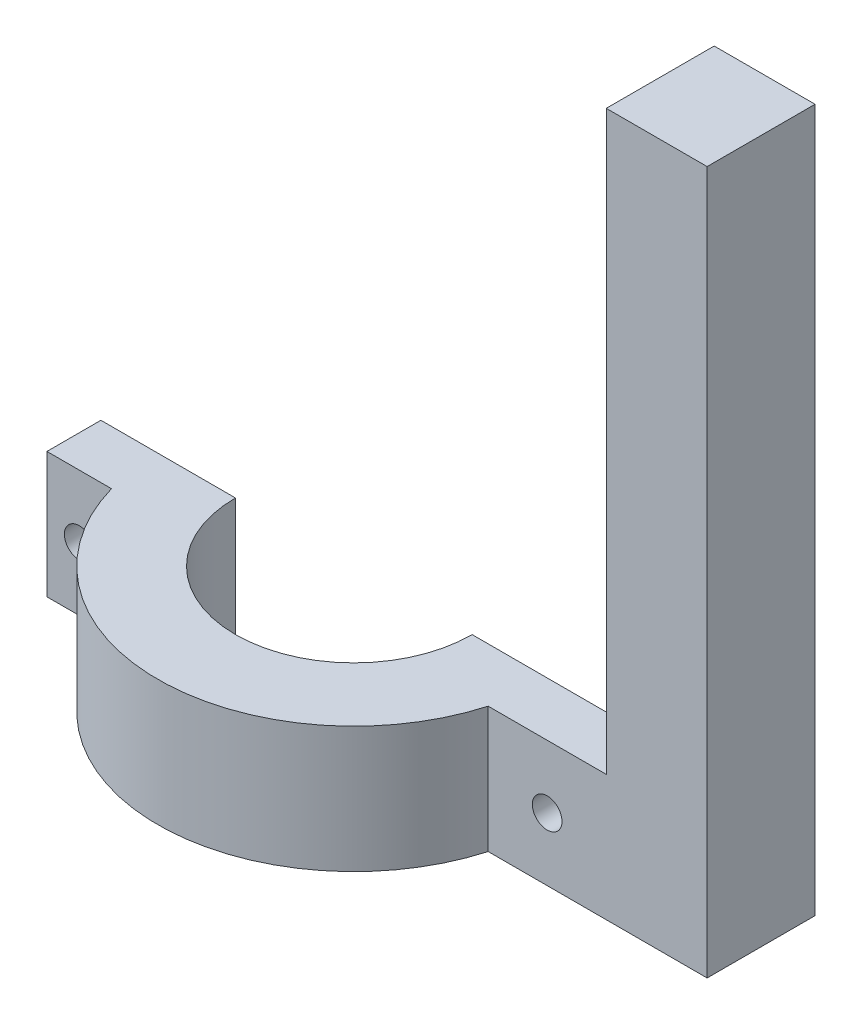
ISO-10303-21;
HEADER;
FILE_DESCRIPTION(('STEP AP214'),'2;1');
FILE_NAME('part.step','',(''),(''),'','','');
FILE_SCHEMA(('AUTOMOTIVE_DESIGN { 1 0 10303 214 1 1 1 1 }'));
ENDSEC;
DATA;
#1=APPLICATION_CONTEXT('core data for automotive mechanical design processes');
#2=APPLICATION_PROTOCOL_DEFINITION('international standard','automotive_design',2000,#1);
#3=PRODUCT_CONTEXT('',#1,'mechanical');
#4=PRODUCT('Part','Part','',(#3));
#5=PRODUCT_RELATED_PRODUCT_CATEGORY('part','',(#4));
#6=PRODUCT_DEFINITION_FORMATION('','',#4);
#7=PRODUCT_DEFINITION_CONTEXT('part definition',#1,'design');
#8=PRODUCT_DEFINITION('design','',#6,#7);
#9=PRODUCT_DEFINITION_SHAPE('','',#8);
#10=(LENGTH_UNIT() NAMED_UNIT(*) SI_UNIT(.MILLI.,.METRE.));
#11=(NAMED_UNIT(*) PLANE_ANGLE_UNIT() SI_UNIT($,.RADIAN.));
#12=(NAMED_UNIT(*) SI_UNIT($,.STERADIAN.) SOLID_ANGLE_UNIT());
#13=UNCERTAINTY_MEASURE_WITH_UNIT(LENGTH_MEASURE(1.E-05),#10,'distance_accuracy_value','');
#14=(GEOMETRIC_REPRESENTATION_CONTEXT(3) GLOBAL_UNCERTAINTY_ASSIGNED_CONTEXT((#13)) GLOBAL_UNIT_ASSIGNED_CONTEXT((#10,
#11,#12)) REPRESENTATION_CONTEXT('',''));
#15=CARTESIAN_POINT('',(0.,0.,0.));
#16=DIRECTION('',(0.,0.,1.));
#17=DIRECTION('',(1.,0.,0.));
#18=AXIS2_PLACEMENT_3D('',#15,#16,#17);
#19=CARTESIAN_POINT('',(25.14,-74.82,6.955));
#20=DIRECTION('',(1.,0.,0.));
#21=DIRECTION('',(0.,0.,-1.));
#22=AXIS2_PLACEMENT_3D('',#19,#20,#21);
#23=PLANE('',#22);
#24=DIRECTION('',(0.,1.,0.));
#25=VECTOR('',#24,1.);
#26=CARTESIAN_POINT('',(25.14,-74.82,6.955));
#27=LINE('',#26,#25);
#28=CARTESIAN_POINT('',(25.14,-58.59,6.955));
#29=VERTEX_POINT('',#28);
#30=CARTESIAN_POINT('',(25.14,15.7457363650206,6.955));
#31=VERTEX_POINT('',#30);
#32=EDGE_CURVE('E187',#29,#31,#27,.T.);
#33=ORIENTED_EDGE('',*,*,#32,.T.);
#34=DIRECTION('',(0.,0.,1.));
#35=VECTOR('',#34,1.);
#36=CARTESIAN_POINT('',(25.14,15.7457363650206,6.955));
#37=LINE('',#36,#35);
#38=CARTESIAN_POINT('',(25.14,15.7457363650206,-6.955));
#39=VERTEX_POINT('',#38);
#40=EDGE_CURVE('E181',#39,#31,#37,.T.);
#41=ORIENTED_EDGE('',*,*,#40,.F.);
#42=DIRECTION('',(0.,1.,0.));
#43=VECTOR('',#42,1.);
#44=CARTESIAN_POINT('',(25.14,-74.82,-6.955));
#45=LINE('',#44,#43);
#46=CARTESIAN_POINT('',(25.14,-74.82,-6.955));
#47=VERTEX_POINT('',#46);
#48=EDGE_CURVE('E179',#47,#39,#45,.T.);
#49=ORIENTED_EDGE('',*,*,#48,.F.);
#50=DIRECTION('',(0.,0.,-1.));
#51=VECTOR('',#50,1.);
#52=CARTESIAN_POINT('',(25.14,-74.82,0.));
#53=LINE('',#52,#51);
#54=CARTESIAN_POINT('',(25.14,-74.82,0.));
#55=VERTEX_POINT('',#54);
#56=EDGE_CURVE('E261',#55,#47,#53,.T.);
#57=ORIENTED_EDGE('',*,*,#56,.F.);
#58=DIRECTION('',(0.,1.,0.));
#59=VECTOR('',#58,1.);
#60=CARTESIAN_POINT('',(25.14,-74.82,0.));
#61=LINE('',#60,#59);
#62=CARTESIAN_POINT('',(25.14,-58.59,0.));
#63=VERTEX_POINT('',#62);
#64=EDGE_CURVE('E211',#55,#63,#61,.T.);
#65=ORIENTED_EDGE('',*,*,#64,.T.);
#66=DIRECTION('',(0.,0.,-1.));
#67=VECTOR('',#66,1.);
#68=CARTESIAN_POINT('',(25.14,-58.59,-6.955));
#69=LINE('',#68,#67);
#70=EDGE_CURVE('E199',#29,#63,#69,.T.);
#71=ORIENTED_EDGE('',*,*,#70,.F.);
#72=EDGE_LOOP('',(#33,#41,#49,#57,#65,#71));
#73=FACE_BOUND('',#72,.T.);
#74=ADVANCED_FACE('F80',(#73),#23,.F.);
#75=CARTESIAN_POINT('',(38.14,5.74573636502059,-6.955));
#76=DIRECTION('',(0.,0.,1.));
#77=DIRECTION('',(0.,-1.,0.));
#78=AXIS2_PLACEMENT_3D('',#75,#76,#77);
#79=PLANE('',#78);
#80=ORIENTED_EDGE('',*,*,#48,.T.);
#81=DIRECTION('',(-1.,0.,0.));
#82=VECTOR('',#81,1.);
#83=CARTESIAN_POINT('',(38.14,15.7457363650206,-6.955));
#84=LINE('',#83,#82);
#85=CARTESIAN_POINT('',(38.14,15.7457363650206,-6.955));
#86=VERTEX_POINT('',#85);
#87=EDGE_CURVE('E166',#86,#39,#84,.T.);
#88=ORIENTED_EDGE('',*,*,#87,.F.);
#89=DIRECTION('',(0.,1.,0.));
#90=VECTOR('',#89,1.);
#91=CARTESIAN_POINT('',(38.14,5.74573636502059,-6.955));
#92=LINE('',#91,#90);
#93=CARTESIAN_POINT('',(38.14,-74.82,-6.955));
#94=VERTEX_POINT('',#93);
#95=EDGE_CURVE('E177',#94,#86,#92,.T.);
#96=ORIENTED_EDGE('',*,*,#95,.F.);
#97=DIRECTION('',(1.,0.,0.));
#98=VECTOR('',#97,1.);
#99=CARTESIAN_POINT('',(38.14,-74.82,-6.955));
#100=LINE('',#99,#98);
#101=EDGE_CURVE('E193',#47,#94,#100,.T.);
#102=ORIENTED_EDGE('',*,*,#101,.F.);
#103=EDGE_LOOP('',(#80,#88,#96,#102));
#104=FACE_BOUND('',#103,.T.);
#105=ADVANCED_FACE('F82',(#104),#79,.F.);
#106=CARTESIAN_POINT('',(38.14,5.74573636502059,6.955));
#107=DIRECTION('',(0.,0.,-1.));
#108=DIRECTION('',(-1.,0.,0.));
#109=AXIS2_PLACEMENT_3D('',#106,#107,#108);
#110=PLANE('',#109);
#111=DIRECTION('',(0.,-1.,0.));
#112=VECTOR('',#111,1.);
#113=CARTESIAN_POINT('',(38.14,5.74573636502059,6.955));
#114=LINE('',#113,#112);
#115=CARTESIAN_POINT('',(38.14,15.7457363650206,6.955));
#116=VERTEX_POINT('',#115);
#117=CARTESIAN_POINT('',(38.14,-74.82,6.955));
#118=VERTEX_POINT('',#117);
#119=EDGE_CURVE('E186',#116,#118,#114,.T.);
#120=ORIENTED_EDGE('',*,*,#119,.F.);
#121=DIRECTION('',(1.,0.,0.));
#122=VECTOR('',#121,1.);
#123=CARTESIAN_POINT('',(38.14,15.7457363650206,6.955));
#124=LINE('',#123,#122);
#125=EDGE_CURVE('E169',#31,#116,#124,.T.);
#126=ORIENTED_EDGE('',*,*,#125,.F.);
#127=ORIENTED_EDGE('',*,*,#32,.F.);
#128=DIRECTION('',(1.,0.,0.));
#129=VECTOR('',#128,1.);
#130=CARTESIAN_POINT('',(9.92000000000001,-58.59,6.955));
#131=LINE('',#130,#129);
#132=CARTESIAN_POINT('',(9.92324607463947,-58.59,6.955));
#133=VERTEX_POINT('',#132);
#134=EDGE_CURVE('E220',#133,#29,#131,.T.);
#135=ORIENTED_EDGE('',*,*,#134,.F.);
#136=DIRECTION('',(0.,1.,0.));
#137=VECTOR('',#136,1.);
#138=CARTESIAN_POINT('',(9.92324607463947,-74.82,6.955));
#139=LINE('',#138,#137);
#140=CARTESIAN_POINT('',(9.92324607463947,-74.82,6.955));
#141=VERTEX_POINT('',#140);
#142=EDGE_CURVE('E200',#133,#141,#139,.F.);
#143=ORIENTED_EDGE('',*,*,#142,.T.);
#144=DIRECTION('',(-1.,0.,0.));
#145=VECTOR('',#144,1.);
#146=CARTESIAN_POINT('',(38.14,-74.82,6.955));
#147=LINE('',#146,#145);
#148=EDGE_CURVE('E214',#118,#141,#147,.T.);
#149=ORIENTED_EDGE('',*,*,#148,.F.);
#150=EDGE_LOOP('',(#120,#126,#127,#135,#143,#149));
#151=FACE_BOUND('',#150,.T.);
#152=CARTESIAN_POINT('',(17.5248952643869,-66.705,6.955));
#153=DIRECTION('',(0.,0.,-1.));
#154=DIRECTION('',(-1.,0.,0.));
#155=AXIS2_PLACEMENT_3D('',#152,#153,#154);
#156=CIRCLE('',#155,1.91);
#157=CARTESIAN_POINT('',(15.6148952643869,-66.705,6.955));
#158=VERTEX_POINT('',#157);
#159=EDGE_CURVE('E196',#158,#158,#156,.T.);
#160=ORIENTED_EDGE('',*,*,#159,.T.);
#161=EDGE_LOOP('',(#160));
#162=FACE_BOUND('',#161,.T.);
#163=ADVANCED_FACE('F269',(#151,#162),#110,.F.);
#164=CARTESIAN_POINT('',(38.14,0.,0.));
#165=DIRECTION('',(1.,0.,0.));
#166=DIRECTION('',(0.,0.,-1.));
#167=AXIS2_PLACEMENT_3D('',#164,#165,#166);
#168=PLANE('',#167);
#169=ORIENTED_EDGE('',*,*,#95,.T.);
#170=DIRECTION('',(0.,0.,-1.));
#171=VECTOR('',#170,1.);
#172=CARTESIAN_POINT('',(38.14,15.7457363650206,6.955));
#173=LINE('',#172,#171);
#174=EDGE_CURVE('E163',#116,#86,#173,.T.);
#175=ORIENTED_EDGE('',*,*,#174,.F.);
#176=ORIENTED_EDGE('',*,*,#119,.T.);
#177=DIRECTION('',(0.,0.,1.));
#178=VECTOR('',#177,1.);
#179=CARTESIAN_POINT('',(38.14,-74.82,6.955));
#180=LINE('',#179,#178);
#181=EDGE_CURVE('E185',#94,#118,#180,.T.);
#182=ORIENTED_EDGE('',*,*,#181,.F.);
#183=EDGE_LOOP('',(#169,#175,#176,#182));
#184=FACE_BOUND('',#183,.T.);
#185=ADVANCED_FACE('F183',(#184),#168,.T.);
#186=CARTESIAN_POINT('',(0.,-74.82,0.));
#187=DIRECTION('',(0.,1.,0.));
#188=DIRECTION('',(0.,0.,1.));
#189=AXIS2_PLACEMENT_3D('',#186,#187,#188);
#190=PLANE('',#189);
#191=DIRECTION('',(0.,0.,-1.));
#192=VECTOR('',#191,1.);
#193=CARTESIAN_POINT('',(-46.9432460746395,-74.82,25.25));
#194=LINE('',#193,#192);
#195=CARTESIAN_POINT('',(-46.9432460746395,-74.82,6.955));
#196=VERTEX_POINT('',#195);
#197=CARTESIAN_POINT('',(-46.9432460746395,-74.82,0.));
#198=VERTEX_POINT('',#197);
#199=EDGE_CURVE('E241',#196,#198,#194,.T.);
#200=ORIENTED_EDGE('',*,*,#199,.T.);
#201=DIRECTION('',(1.,0.,0.));
#202=VECTOR('',#201,1.);
#203=CARTESIAN_POINT('',(25.14,-74.82,0.));
#204=LINE('',#203,#202);
#205=CARTESIAN_POINT('',(-29.6,-74.82,0.));
#206=VERTEX_POINT('',#205);
#207=EDGE_CURVE('E105',#198,#206,#204,.T.);
#208=ORIENTED_EDGE('',*,*,#207,.T.);
#209=CARTESIAN_POINT('',(-14.35,-74.82,0.));
#210=DIRECTION('',(0.,1.,0.));
#211=DIRECTION('',(0.,0.,1.));
#212=AXIS2_PLACEMENT_3D('',#209,#210,#211);
#213=CIRCLE('',#212,15.25);
#214=CARTESIAN_POINT('',(0.900000000000007,-74.82,0.));
#215=VERTEX_POINT('',#214);
#216=EDGE_CURVE('E231',#206,#215,#213,.T.);
#217=ORIENTED_EDGE('',*,*,#216,.T.);
#218=EDGE_CURVE('E97',#215,#55,#204,.T.);
#219=ORIENTED_EDGE('',*,*,#218,.T.);
#220=ORIENTED_EDGE('',*,*,#56,.T.);
#221=ORIENTED_EDGE('',*,*,#101,.T.);
#222=ORIENTED_EDGE('',*,*,#181,.T.);
#223=ORIENTED_EDGE('',*,*,#148,.T.);
#224=CARTESIAN_POINT('',(-14.35,-74.82,0.));
#225=DIRECTION('',(0.,1.,0.));
#226=DIRECTION('',(1.,0.,0.));
#227=AXIS2_PLACEMENT_3D('',#224,#225,#226);
#228=CIRCLE('',#227,25.25);
#229=CARTESIAN_POINT('',(-38.6232460746395,-74.82,6.955));
#230=VERTEX_POINT('',#229);
#231=EDGE_CURVE('E228',#230,#141,#228,.T.);
#232=ORIENTED_EDGE('',*,*,#231,.F.);
#233=DIRECTION('',(1.,0.,0.));
#234=VECTOR('',#233,1.);
#235=CARTESIAN_POINT('',(-50.,-74.82,6.955));
#236=LINE('',#235,#234);
#237=EDGE_CURVE('E236',#196,#230,#236,.T.);
#238=ORIENTED_EDGE('',*,*,#237,.F.);
#239=EDGE_LOOP('',(#200,#208,#217,#219,#220,#221,#222,#223,#232,#238));
#240=FACE_BOUND('',#239,.T.);
#241=ADVANCED_FACE('F272',(#240),#190,.F.);
#242=CARTESIAN_POINT('',(9.92000000000001,-58.59,-6.955));
#243=DIRECTION('',(0.,-1.,0.));
#244=DIRECTION('',(0.,0.,-1.));
#245=AXIS2_PLACEMENT_3D('',#242,#243,#244);
#246=PLANE('',#245);
#247=ORIENTED_EDGE('',*,*,#70,.T.);
#248=DIRECTION('',(1.,0.,0.));
#249=VECTOR('',#248,1.);
#250=CARTESIAN_POINT('',(25.14,-58.59,0.));
#251=LINE('',#250,#249);
#252=CARTESIAN_POINT('',(0.900000000000007,-58.59,0.));
#253=VERTEX_POINT('',#252);
#254=EDGE_CURVE('E257',#253,#63,#251,.T.);
#255=ORIENTED_EDGE('',*,*,#254,.F.);
#256=CARTESIAN_POINT('',(-14.35,-58.59,0.));
#257=DIRECTION('',(0.,1.,0.));
#258=DIRECTION('',(0.,0.,1.));
#259=AXIS2_PLACEMENT_3D('',#256,#257,#258);
#260=CIRCLE('',#259,15.25);
#261=CARTESIAN_POINT('',(-29.6,-58.59,0.));
#262=VERTEX_POINT('',#261);
#263=EDGE_CURVE('E233',#262,#253,#260,.T.);
#264=ORIENTED_EDGE('',*,*,#263,.F.);
#265=CARTESIAN_POINT('',(-46.9432460746395,-58.59,0.));
#266=VERTEX_POINT('',#265);
#267=EDGE_CURVE('E259',#266,#262,#251,.T.);
#268=ORIENTED_EDGE('',*,*,#267,.F.);
#269=DIRECTION('',(0.,0.,-1.));
#270=VECTOR('',#269,1.);
#271=CARTESIAN_POINT('',(-46.9432460746395,-58.59,25.25));
#272=LINE('',#271,#270);
#273=CARTESIAN_POINT('',(-46.9432460746395,-58.59,6.955));
#274=VERTEX_POINT('',#273);
#275=EDGE_CURVE('E206',#274,#266,#272,.T.);
#276=ORIENTED_EDGE('',*,*,#275,.F.);
#277=DIRECTION('',(1.,0.,0.));
#278=VECTOR('',#277,1.);
#279=CARTESIAN_POINT('',(-50.,-58.59,6.955));
#280=LINE('',#279,#278);
#281=CARTESIAN_POINT('',(-38.6232460746395,-58.59,6.955));
#282=VERTEX_POINT('',#281);
#283=EDGE_CURVE('E239',#274,#282,#280,.T.);
#284=ORIENTED_EDGE('',*,*,#283,.T.);
#285=CARTESIAN_POINT('',(-14.35,-58.59,0.));
#286=DIRECTION('',(0.,1.,0.));
#287=DIRECTION('',(1.,0.,0.));
#288=AXIS2_PLACEMENT_3D('',#285,#286,#287);
#289=CIRCLE('',#288,25.25);
#290=EDGE_CURVE('E229',#282,#133,#289,.T.);
#291=ORIENTED_EDGE('',*,*,#290,.T.);
#292=ORIENTED_EDGE('',*,*,#134,.T.);
#293=EDGE_LOOP('',(#247,#255,#264,#268,#276,#284,#291,#292));
#294=FACE_BOUND('',#293,.T.);
#295=ADVANCED_FACE('F275',(#294),#246,.F.);
#296=CARTESIAN_POINT('',(17.5248952643869,-66.705,8.26499999999999));
#297=DIRECTION('',(0.,0.,-1.));
#298=DIRECTION('',(0.,1.,0.));
#299=AXIS2_PLACEMENT_3D('',#296,#297,#298);
#300=CYLINDRICAL_SURFACE('',#299,1.91);
#301=CARTESIAN_POINT('',(17.5248952643869,-66.705,0.));
#302=DIRECTION('',(0.,0.,1.));
#303=DIRECTION('',(1.,0.,0.));
#304=AXIS2_PLACEMENT_3D('',#301,#302,#303);
#305=CIRCLE('',#304,1.91);
#306=CARTESIAN_POINT('',(19.4348952643869,-66.705,0.));
#307=VERTEX_POINT('',#306);
#308=EDGE_CURVE('E207',#307,#307,#305,.F.);
#309=ORIENTED_EDGE('',*,*,#308,.T.);
#310=EDGE_LOOP('',(#309));
#311=FACE_BOUND('',#310,.T.);
#312=ORIENTED_EDGE('',*,*,#159,.F.);
#313=EDGE_LOOP('',(#312));
#314=FACE_BOUND('',#313,.T.);
#315=ADVANCED_FACE('F281',(#311,#314),#300,.F.);
#316=CARTESIAN_POINT('',(-14.35,-74.82,0.));
#317=DIRECTION('',(0.,1.,0.));
#318=DIRECTION('',(0.,0.,1.));
#319=AXIS2_PLACEMENT_3D('',#316,#317,#318);
#320=CYLINDRICAL_SURFACE('',#319,25.25);
#321=DIRECTION('',(0.,1.,0.));
#322=VECTOR('',#321,1.);
#323=CARTESIAN_POINT('',(-38.6232460746395,-74.82,6.955));
#324=LINE('',#323,#322);
#325=EDGE_CURVE('E89',#230,#282,#324,.T.);
#326=ORIENTED_EDGE('',*,*,#325,.F.);
#327=ORIENTED_EDGE('',*,*,#231,.T.);
#328=ORIENTED_EDGE('',*,*,#142,.F.);
#329=ORIENTED_EDGE('',*,*,#290,.F.);
#330=EDGE_LOOP('',(#326,#327,#328,#329));
#331=FACE_BOUND('',#330,.T.);
#332=ADVANCED_FACE('F350',(#331),#320,.T.);
#333=CARTESIAN_POINT('',(-14.35,-74.82,0.));
#334=DIRECTION('',(0.,1.,0.));
#335=DIRECTION('',(0.,0.,1.));
#336=AXIS2_PLACEMENT_3D('',#333,#334,#335);
#337=CYLINDRICAL_SURFACE('',#336,15.25);
#338=ORIENTED_EDGE('',*,*,#263,.T.);
#339=DIRECTION('',(0.,1.,0.));
#340=VECTOR('',#339,1.);
#341=CARTESIAN_POINT('',(0.900000000000007,-74.82,0.));
#342=LINE('',#341,#340);
#343=EDGE_CURVE('E249',#253,#215,#342,.F.);
#344=ORIENTED_EDGE('',*,*,#343,.T.);
#345=ORIENTED_EDGE('',*,*,#216,.F.);
#346=DIRECTION('',(0.,1.,0.));
#347=VECTOR('',#346,1.);
#348=CARTESIAN_POINT('',(-29.6,-74.82,0.));
#349=LINE('',#348,#347);
#350=EDGE_CURVE('E251',#206,#262,#349,.T.);
#351=ORIENTED_EDGE('',*,*,#350,.T.);
#352=EDGE_LOOP('',(#338,#344,#345,#351));
#353=FACE_BOUND('',#352,.T.);
#354=ADVANCED_FACE('F346',(#353),#337,.F.);
#355=CARTESIAN_POINT('',(-50.,-58.59,6.955));
#356=DIRECTION('',(0.,0.,1.));
#357=DIRECTION('',(1.,0.,0.));
#358=AXIS2_PLACEMENT_3D('',#355,#356,#357);
#359=PLANE('',#358);
#360=CARTESIAN_POINT('',(-42.7865081517211,-66.705,6.955));
#361=DIRECTION('',(0.,0.,1.));
#362=DIRECTION('',(1.,0.,0.));
#363=AXIS2_PLACEMENT_3D('',#360,#361,#362);
#364=CIRCLE('',#363,1.91);
#365=CARTESIAN_POINT('',(-40.8765081517211,-66.705,6.955));
#366=VERTEX_POINT('',#365);
#367=EDGE_CURVE('E203',#366,#366,#364,.T.);
#368=ORIENTED_EDGE('',*,*,#367,.F.);
#369=EDGE_LOOP('',(#368));
#370=FACE_BOUND('',#369,.T.);
#371=DIRECTION('',(0.,1.,0.));
#372=VECTOR('',#371,1.);
#373=CARTESIAN_POINT('',(-46.9432460746395,-58.59,6.955));
#374=LINE('',#373,#372);
#375=EDGE_CURVE('E14',#196,#274,#374,.T.);
#376=ORIENTED_EDGE('',*,*,#375,.F.);
#377=ORIENTED_EDGE('',*,*,#237,.T.);
#378=ORIENTED_EDGE('',*,*,#325,.T.);
#379=ORIENTED_EDGE('',*,*,#283,.F.);
#380=EDGE_LOOP('',(#376,#377,#378,#379));
#381=FACE_BOUND('',#380,.T.);
#382=ADVANCED_FACE('F340',(#370,#381),#359,.T.);
#383=CARTESIAN_POINT('',(-46.9432460746395,-74.82,25.25));
#384=DIRECTION('',(1.,0.,0.));
#385=DIRECTION('',(0.,0.,-1.));
#386=AXIS2_PLACEMENT_3D('',#383,#384,#385);
#387=PLANE('',#386);
#388=ORIENTED_EDGE('',*,*,#275,.T.);
#389=DIRECTION('',(0.,-1.,0.));
#390=VECTOR('',#389,1.);
#391=CARTESIAN_POINT('',(-46.9432460746395,-74.82,0.));
#392=LINE('',#391,#390);
#393=EDGE_CURVE('E210',#266,#198,#392,.T.);
#394=ORIENTED_EDGE('',*,*,#393,.T.);
#395=ORIENTED_EDGE('',*,*,#199,.F.);
#396=ORIENTED_EDGE('',*,*,#375,.T.);
#397=EDGE_LOOP('',(#388,#394,#395,#396));
#398=FACE_BOUND('',#397,.T.);
#399=ADVANCED_FACE('F332',(#398),#387,.F.);
#400=CARTESIAN_POINT('',(-42.7865081517211,-66.705,25.25));
#401=DIRECTION('',(0.,0.,-1.));
#402=DIRECTION('',(-1.,0.,0.));
#403=AXIS2_PLACEMENT_3D('',#400,#401,#402);
#404=CYLINDRICAL_SURFACE('',#403,1.91);
#405=CARTESIAN_POINT('',(-42.7865081517211,-66.705,0.));
#406=DIRECTION('',(0.,0.,1.));
#407=DIRECTION('',(1.,0.,0.));
#408=AXIS2_PLACEMENT_3D('',#405,#406,#407);
#409=CIRCLE('',#408,1.91);
#410=CARTESIAN_POINT('',(-40.8765081517211,-66.705,0.));
#411=VERTEX_POINT('',#410);
#412=EDGE_CURVE('E208',#411,#411,#409,.F.);
#413=ORIENTED_EDGE('',*,*,#412,.T.);
#414=EDGE_LOOP('',(#413));
#415=FACE_BOUND('',#414,.T.);
#416=ORIENTED_EDGE('',*,*,#367,.T.);
#417=EDGE_LOOP('',(#416));
#418=FACE_BOUND('',#417,.T.);
#419=ADVANCED_FACE('F321',(#415,#418),#404,.F.);
#420=CARTESIAN_POINT('',(25.14,-74.82,0.));
#421=DIRECTION('',(0.,0.,1.));
#422=DIRECTION('',(1.,0.,0.));
#423=AXIS2_PLACEMENT_3D('',#420,#421,#422);
#424=PLANE('',#423);
#425=ORIENTED_EDGE('',*,*,#412,.F.);
#426=EDGE_LOOP('',(#425));
#427=FACE_BOUND('',#426,.T.);
#428=ORIENTED_EDGE('',*,*,#207,.F.);
#429=ORIENTED_EDGE('',*,*,#393,.F.);
#430=ORIENTED_EDGE('',*,*,#267,.T.);
#431=ORIENTED_EDGE('',*,*,#350,.F.);
#432=EDGE_LOOP('',(#428,#429,#430,#431));
#433=FACE_BOUND('',#432,.T.);
#434=ADVANCED_FACE('F315',(#427,#433),#424,.F.);
#435=ORIENTED_EDGE('',*,*,#254,.T.);
#436=ORIENTED_EDGE('',*,*,#64,.F.);
#437=ORIENTED_EDGE('',*,*,#218,.F.);
#438=ORIENTED_EDGE('',*,*,#343,.F.);
#439=EDGE_LOOP('',(#435,#436,#437,#438));
#440=FACE_BOUND('',#439,.T.);
#441=ORIENTED_EDGE('',*,*,#308,.F.);
#442=EDGE_LOOP('',(#441));
#443=FACE_BOUND('',#442,.T.);
#444=ADVANCED_FACE('F308',(#440,#443),#424,.F.);
#445=CARTESIAN_POINT('',(39.14,15.7457363650206,70.9));
#446=DIRECTION('',(0.,-1.,0.));
#447=DIRECTION('',(0.,0.,-1.));
#448=AXIS2_PLACEMENT_3D('',#445,#446,#447);
#449=PLANE('',#448);
#450=ORIENTED_EDGE('',*,*,#125,.T.);
#451=ORIENTED_EDGE('',*,*,#174,.T.);
#452=ORIENTED_EDGE('',*,*,#87,.T.);
#453=ORIENTED_EDGE('',*,*,#40,.T.);
#454=EDGE_LOOP('',(#450,#451,#452,#453));
#455=FACE_BOUND('',#454,.T.);
#456=ADVANCED_FACE('F165',(#455),#449,.F.);
#457=CLOSED_SHELL('',(#74,#105,#163,#185,#241,#295,#315,#332,#354,#382,#399,#419,#434,#444,#456));
#458=MANIFOLD_SOLID_BREP('B2',#457);
#459=ADVANCED_BREP_SHAPE_REPRESENTATION('',(#18,#458),#14);
#460=SHAPE_DEFINITION_REPRESENTATION(#9,#459);
ENDSEC;
END-ISO-10303-21;
